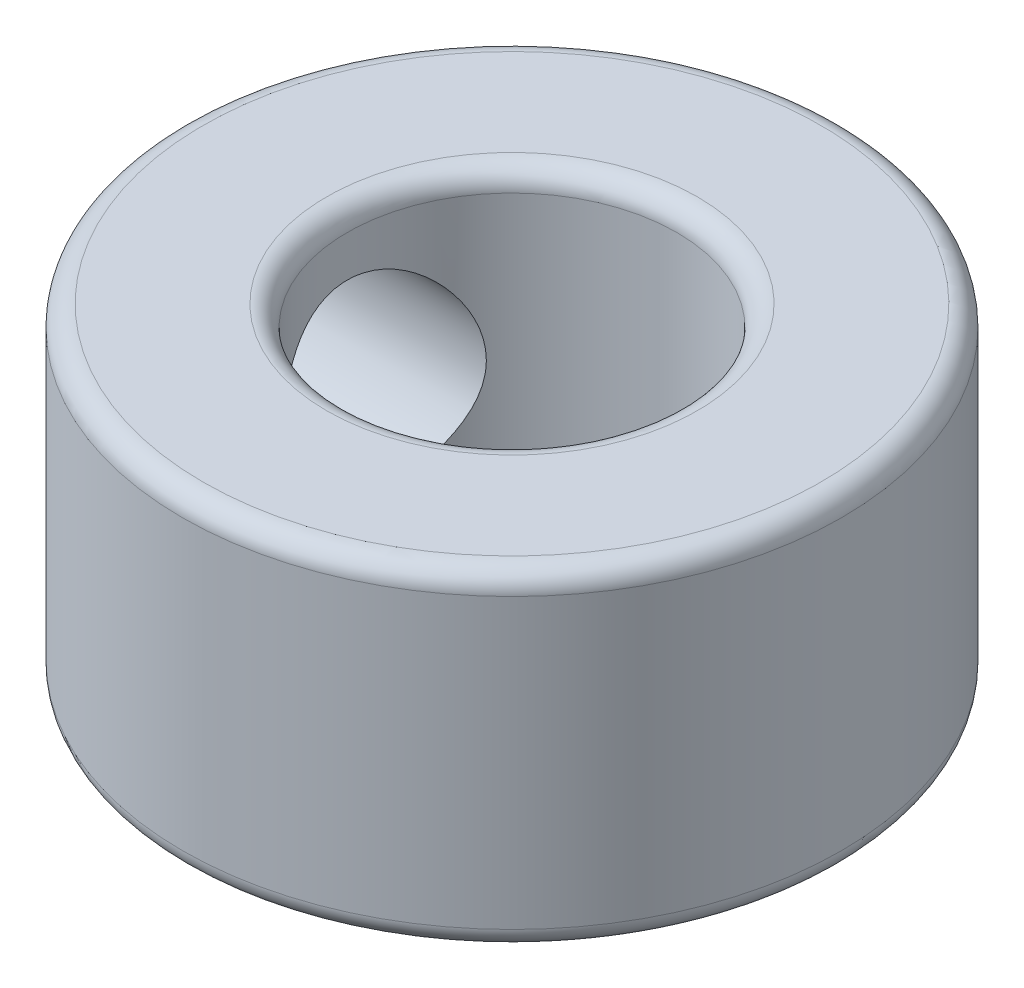
ISO-10303-21;
HEADER;
FILE_DESCRIPTION(('STEP AP214'),'2;1');
FILE_NAME('part.step','',(''),(''),'','','');
FILE_SCHEMA(('AUTOMOTIVE_DESIGN { 1 0 10303 214 1 1 1 1 }'));
ENDSEC;
DATA;
#1=APPLICATION_CONTEXT('core data for automotive mechanical design processes');
#2=APPLICATION_PROTOCOL_DEFINITION('international standard','automotive_design',2000,#1);
#3=PRODUCT_CONTEXT('',#1,'mechanical');
#4=PRODUCT('Part','Part','',(#3));
#5=PRODUCT_RELATED_PRODUCT_CATEGORY('part','',(#4));
#6=PRODUCT_DEFINITION_FORMATION('','',#4);
#7=PRODUCT_DEFINITION_CONTEXT('part definition',#1,'design');
#8=PRODUCT_DEFINITION('design','',#6,#7);
#9=PRODUCT_DEFINITION_SHAPE('','',#8);
#10=(LENGTH_UNIT() NAMED_UNIT(*) SI_UNIT(.MILLI.,.METRE.));
#11=(NAMED_UNIT(*) PLANE_ANGLE_UNIT() SI_UNIT($,.RADIAN.));
#12=(NAMED_UNIT(*) SI_UNIT($,.STERADIAN.) SOLID_ANGLE_UNIT());
#13=UNCERTAINTY_MEASURE_WITH_UNIT(LENGTH_MEASURE(1.E-05),#10,'distance_accuracy_value','');
#14=(GEOMETRIC_REPRESENTATION_CONTEXT(3) GLOBAL_UNCERTAINTY_ASSIGNED_CONTEXT((#13)) GLOBAL_UNIT_ASSIGNED_CONTEXT((#10,
#11,#12)) REPRESENTATION_CONTEXT('',''));
#15=CARTESIAN_POINT('',(0.,0.,0.));
#16=DIRECTION('',(0.,0.,1.));
#17=DIRECTION('',(1.,0.,0.));
#18=AXIS2_PLACEMENT_3D('',#15,#16,#17);
#19=CARTESIAN_POINT('',(0.,8.,0.));
#20=DIRECTION('',(0.,1.,0.));
#21=DIRECTION('',(0.,0.,1.));
#22=AXIS2_PLACEMENT_3D('',#19,#20,#21);
#23=PLANE('',#22);
#24=CARTESIAN_POINT('',(0.,8.,0.));
#25=DIRECTION('',(0.,1.,0.));
#26=DIRECTION('',(0.,0.,1.));
#27=AXIS2_PLACEMENT_3D('',#24,#25,#26);
#28=CIRCLE('',#27,4.5);
#29=CARTESIAN_POINT('',(0.,8.,4.5));
#30=VERTEX_POINT('',#29);
#31=EDGE_CURVE('E43',#30,#30,#28,.F.);
#32=ORIENTED_EDGE('',*,*,#31,.T.);
#33=EDGE_LOOP('',(#32));
#34=FACE_BOUND('',#33,.T.);
#35=CARTESIAN_POINT('',(0.,8.,0.));
#36=DIRECTION('',(0.,1.,0.));
#37=DIRECTION('',(0.,0.,1.));
#38=AXIS2_PLACEMENT_3D('',#35,#36,#37);
#39=CIRCLE('',#38,7.5);
#40=CARTESIAN_POINT('',(0.,8.,7.5));
#41=VERTEX_POINT('',#40);
#42=EDGE_CURVE('E47',#41,#41,#39,.T.);
#43=ORIENTED_EDGE('',*,*,#42,.T.);
#44=EDGE_LOOP('',(#43));
#45=FACE_BOUND('',#44,.T.);
#46=ADVANCED_FACE('F32',(#34,#45),#23,.T.);
#47=CARTESIAN_POINT('',(0.,0.,0.));
#48=DIRECTION('',(0.,1.,0.));
#49=DIRECTION('',(0.,0.,1.));
#50=AXIS2_PLACEMENT_3D('',#47,#48,#49);
#51=PLANE('',#50);
#52=CARTESIAN_POINT('',(0.,0.,0.));
#53=DIRECTION('',(0.,1.,0.));
#54=DIRECTION('',(0.,0.,1.));
#55=AXIS2_PLACEMENT_3D('',#52,#53,#54);
#56=CIRCLE('',#55,4.5);
#57=CARTESIAN_POINT('',(0.,0.,4.5));
#58=VERTEX_POINT('',#57);
#59=EDGE_CURVE('E58',#58,#58,#56,.T.);
#60=ORIENTED_EDGE('',*,*,#59,.T.);
#61=EDGE_LOOP('',(#60));
#62=FACE_BOUND('',#61,.T.);
#63=CARTESIAN_POINT('',(0.,0.,0.));
#64=DIRECTION('',(0.,1.,0.));
#65=DIRECTION('',(0.,0.,1.));
#66=AXIS2_PLACEMENT_3D('',#63,#64,#65);
#67=CIRCLE('',#66,7.5);
#68=CARTESIAN_POINT('',(0.,0.,7.5));
#69=VERTEX_POINT('',#68);
#70=EDGE_CURVE('E61',#69,#69,#67,.F.);
#71=ORIENTED_EDGE('',*,*,#70,.T.);
#72=EDGE_LOOP('',(#71));
#73=FACE_BOUND('',#72,.T.);
#74=ADVANCED_FACE('F97',(#62,#73),#51,.F.);
#75=CARTESIAN_POINT('',(0.,8.,0.));
#76=DIRECTION('',(0.,-1.,0.));
#77=DIRECTION('',(0.,0.,-1.));
#78=AXIS2_PLACEMENT_3D('',#75,#76,#77);
#79=CYLINDRICAL_SURFACE('',#78,8.);
#80=CARTESIAN_POINT('',(0.,0.5,0.));
#81=DIRECTION('',(0.,1.,0.));
#82=DIRECTION('',(0.,0.,1.));
#83=AXIS2_PLACEMENT_3D('',#80,#81,#82);
#84=CIRCLE('',#83,8.);
#85=CARTESIAN_POINT('',(0.,0.5,8.));
#86=VERTEX_POINT('',#85);
#87=EDGE_CURVE('E10',#86,#86,#84,.T.);
#88=ORIENTED_EDGE('',*,*,#87,.T.);
#89=EDGE_LOOP('',(#88));
#90=FACE_BOUND('',#89,.T.);
#91=CARTESIAN_POINT('',(0.,7.5,0.));
#92=DIRECTION('',(0.,1.,0.));
#93=DIRECTION('',(0.,0.,1.));
#94=AXIS2_PLACEMENT_3D('',#91,#92,#93);
#95=CIRCLE('',#94,8.);
#96=CARTESIAN_POINT('',(0.,7.5,8.));
#97=VERTEX_POINT('',#96);
#98=EDGE_CURVE('E39',#97,#97,#95,.F.);
#99=ORIENTED_EDGE('',*,*,#98,.T.);
#100=EDGE_LOOP('',(#99));
#101=FACE_BOUND('',#100,.T.);
#102=CARTESIAN_POINT('',(-8.,1.5,0.));
#103=CARTESIAN_POINT('',(-7.9999993175598,1.50000089317515,-0.136878370349093));
#104=CARTESIAN_POINT('',(-7.99645389969682,1.51127845388891,-0.273766105005719));
#105=CARTESIAN_POINT('',(-7.98265788177613,1.55597248307847,-0.543538419176897));
#106=CARTESIAN_POINT('',(-7.97240576399719,1.58939396272872,-0.676422085451815));
#107=CARTESIAN_POINT('',(-7.94631631395819,1.67713874239147,-0.934257087301613));
#108=CARTESIAN_POINT('',(-7.9304876299805,1.73142968930593,-1.05922035397161));
#109=CARTESIAN_POINT('',(-7.89487938322185,1.85923463535666,-1.29826960469292));
#110=CARTESIAN_POINT('',(-7.8750991979981,1.93275166356117,-1.41235387088977));
#111=CARTESIAN_POINT('',(-7.83300427480565,2.09931198403472,-1.62993066990456));
#112=CARTESIAN_POINT('',(-7.81063431853978,2.19284177012214,-1.73304005631332));
#113=CARTESIAN_POINT('',(-7.76620092748417,2.3957367848271,-1.92239476407399));
#114=CARTESIAN_POINT('',(-7.74413755046914,2.50510495498909,-2.00863694579739));
#115=CARTESIAN_POINT('',(-7.70222289396344,2.73988912761617,-2.16388672966227));
#116=CARTESIAN_POINT('',(-7.68243976603591,2.86563495505444,-2.23241568300258));
#117=CARTESIAN_POINT('',(-7.64815603598469,3.12758462996375,-2.34719482153343));
#118=CARTESIAN_POINT('',(-7.63365404257377,3.26378571158786,-2.39345087543889));
#119=CARTESIAN_POINT('',(-7.61215213969001,3.53845615490412,-2.46096919860067));
#120=CARTESIAN_POINT('',(-7.60493945859017,3.67673368727771,-2.48294220015729));
#121=CARTESIAN_POINT('',(-7.59820110281901,3.95518623782379,-2.50349110073976));
#122=CARTESIAN_POINT('',(-7.59867338454668,4.09536074164332,-2.50207321991544));
#123=CARTESIAN_POINT('',(-7.60706378150876,4.36774892053797,-2.47643649465479));
#124=CARTESIAN_POINT('',(-7.61468683491897,4.50005825172313,-2.45312115738766));
#125=CARTESIAN_POINT('',(-7.63604051304978,4.75878431307469,-2.38581626711252));
#126=CARTESIAN_POINT('',(-7.64977178686229,4.8852004154176,-2.34182451689101));
#127=CARTESIAN_POINT('',(-7.68202088028593,5.13070388886527,-2.23377749362554));
#128=CARTESIAN_POINT('',(-7.70060569321649,5.24965722138397,-2.16943851324164));
#129=CARTESIAN_POINT('',(-7.7404371316014,5.47537553575825,-2.02272041475696));
#130=CARTESIAN_POINT('',(-7.76168444789102,5.58213734050743,-1.94033661043155));
#131=CARTESIAN_POINT('',(-7.80563055600986,5.78554988683398,-1.75543390836425));
#132=CARTESIAN_POINT('',(-7.82835139211391,5.88151911555937,-1.65216914118564));
#133=CARTESIAN_POINT('',(-7.8718314151916,6.05494378715936,-1.43072881619106));
#134=CARTESIAN_POINT('',(-7.89259045676745,6.13239785843842,-1.31255215469804));
#135=CARTESIAN_POINT('',(-7.93002589780382,6.26705537720255,-1.06332922093091));
#136=CARTESIAN_POINT('',(-7.94666921296415,6.32409627092794,-0.932189813838558));
#137=CARTESIAN_POINT('',(-7.97375911657108,6.41510600170313,-0.661535955565288));
#138=CARTESIAN_POINT('',(-7.98420758650304,6.44908184447679,-0.522024061449216));
#139=CARTESIAN_POINT('',(-7.99742778790027,6.49183608515796,-0.24437031458069));
#140=CARTESIAN_POINT('',(-8.00048045790873,6.50153708718705,-0.106383697577686));
#141=CARTESIAN_POINT('',(-7.99939599461967,6.49806754672534,0.169260611465172));
#142=CARTESIAN_POINT('',(-7.9952599116227,6.48490034535478,0.306918348613018));
#143=CARTESIAN_POINT('',(-7.98044727539523,6.43680881478723,0.574438665951698));
#144=CARTESIAN_POINT('',(-7.96993586221374,6.40243346477503,0.704409956841873));
#145=CARTESIAN_POINT('',(-7.94360242758579,6.31357129526657,0.956703857722754));
#146=CARTESIAN_POINT('',(-7.92777975028687,6.25908199194998,1.07902552089812));
#147=CARTESIAN_POINT('',(-7.89197085518848,6.13005356690263,1.31586481334438));
#148=CARTESIAN_POINT('',(-7.87189253635335,6.05505802500638,1.43011947957558));
#149=CARTESIAN_POINT('',(-7.82986820006859,5.88769357976515,1.64473170192052));
#150=CARTESIAN_POINT('',(-7.80792167695774,5.79531996451072,1.7450854760879));
#151=CARTESIAN_POINT('',(-7.76353989766283,5.5914822198958,1.93317492583804));
#152=CARTESIAN_POINT('',(-7.74111973412883,5.47940667252155,2.02025304679063));
#153=CARTESIAN_POINT('',(-7.69923894191212,5.24174676724645,2.17442500490303));
#154=CARTESIAN_POINT('',(-7.67977826622621,5.11616262394603,2.24151915946859));
#155=CARTESIAN_POINT('',(-7.64623564661738,4.85530965425905,2.35340166961085));
#156=CARTESIAN_POINT('',(-7.63213292713749,4.72008070112856,2.39827639112025));
#157=CARTESIAN_POINT('',(-7.6110234168862,4.44345501350276,2.4644578863618));
#158=CARTESIAN_POINT('',(-7.60401392602456,4.30206064731293,2.48577362827989));
#159=CARTESIAN_POINT('',(-7.59816585427753,4.02399182483914,2.50358812316251));
#160=CARTESIAN_POINT('',(-7.59897209200284,3.88739309230516,2.50116559243271));
#161=CARTESIAN_POINT('',(-7.60780180751807,3.61665083011612,2.47417636257668));
#162=CARTESIAN_POINT('',(-7.61582494863208,3.48250718622653,2.44961069645024));
#163=CARTESIAN_POINT('',(-7.6379362836678,3.22241192081621,2.37975459827235));
#164=CARTESIAN_POINT('',(-7.65193396380513,3.09636911781328,2.33477284812016));
#165=CARTESIAN_POINT('',(-7.68439408509128,2.85351917293199,2.22560454669999));
#166=CARTESIAN_POINT('',(-7.70285743429343,2.73671391584319,2.16141408888474));
#167=CARTESIAN_POINT('',(-7.74306974067005,2.51070805912037,2.01271350026986));
#168=CARTESIAN_POINT('',(-7.76491897845913,2.40198374099952,1.92750667048265));
#169=CARTESIAN_POINT('',(-7.8089799764242,2.200027343776,1.7404179928096));
#170=CARTESIAN_POINT('',(-7.83119183213309,2.10679942201788,1.63853168468878));
#171=CARTESIAN_POINT('',(-7.87434543904947,1.93543492327414,1.41697332564669));
#172=CARTESIAN_POINT('',(-7.89522203461346,1.8578905271001,1.29682914897477));
#173=CARTESIAN_POINT('',(-7.93253538593756,1.72420216972109,1.0445582760273));
#174=CARTESIAN_POINT('',(-7.94897388631644,1.66804979571633,0.912436315590896));
#175=CARTESIAN_POINT('',(-7.97441301466941,1.58281726478307,0.651495270747956));
#176=CARTESIAN_POINT('',(-7.98392481612283,1.55185026538932,0.523340674225091));
#177=CARTESIAN_POINT('',(-7.99671800680967,1.51044328006457,0.263459790880494));
#178=CARTESIAN_POINT('',(-8.00000065679286,1.49999914039199,0.131734232279349));
#179=CARTESIAN_POINT('',(-8.,1.5,0.));
#180=B_SPLINE_CURVE_WITH_KNOTS('',3,(#102,#103,#104,#105,#106,#107,#108,#109,#110,#111,#112,
#113,#114,#115,#116,#117,#118,#119,#120,#121,#122,#123,#124,#125,#126,#127,#128,#129,#130,#131,
#132,#133,#134,#135,#136,#137,#138,#139,#140,#141,#142,#143,#144,#145,#146,#147,#148,#149,#150,
#151,#152,#153,#154,#155,#156,#157,#158,#159,#160,#161,#162,#163,#164,#165,#166,#167,#168,#169,
#170,#171,#172,#173,#174,#175,#176,#177,#178,#179),.UNSPECIFIED.,.T.,.F.,(4,2,2,2,2,2,2,2,2,2,2,
2,2,2,2,2,2,2,2,2,2,2,2,2,2,2,2,2,2,2,2,2,2,2,2,2,2,2,4),(0.,0.41015089886502,0.820394646698133,
1.23000495840487,1.63967984311678,2.06075644390317,2.48191134862552,2.91347542494988,
3.34492572559054,3.7633830033442,4.18172900590277,4.58353834844338,4.98539039958126,
5.39311285441091,5.80094132020717,6.227334945592,6.65376014826607,7.0835092137954,
7.51312768989108,7.92615137096475,8.33911471298726,8.74181253445744,9.14456010069,
9.55712649476686,9.96980491418519,10.3988355742628,10.8278594196742,11.2552023150671,
11.6823824779468,12.0902440696666,12.4980866352126,12.8999582681244,13.3019116867944,
13.7195902803182,14.1373807476578,14.5688133627192,15.0000761335177,15.3948927332218,
15.7896294154519),.UNSPECIFIED.);
#181=CARTESIAN_POINT('',(-8.,1.5,0.));
#182=VERTEX_POINT('',#181);
#183=EDGE_CURVE('E64',#182,#182,#180,.T.);
#184=ORIENTED_EDGE('',*,*,#183,.T.);
#185=EDGE_LOOP('',(#184));
#186=FACE_BOUND('',#185,.T.);
#187=ADVANCED_FACE('F93',(#90,#101,#186),#79,.T.);
#188=CARTESIAN_POINT('',(0.,8.,0.));
#189=DIRECTION('',(0.,-1.,0.));
#190=DIRECTION('',(0.,0.,-1.));
#191=AXIS2_PLACEMENT_3D('',#188,#189,#190);
#192=CYLINDRICAL_SURFACE('',#191,4.);
#193=CARTESIAN_POINT('',(0.,0.5,0.));
#194=DIRECTION('',(0.,1.,0.));
#195=DIRECTION('',(0.,0.,1.));
#196=AXIS2_PLACEMENT_3D('',#193,#194,#195);
#197=CIRCLE('',#196,4.);
#198=CARTESIAN_POINT('',(0.,0.5,4.));
#199=VERTEX_POINT('',#198);
#200=EDGE_CURVE('E52',#199,#199,#197,.F.);
#201=ORIENTED_EDGE('',*,*,#200,.T.);
#202=EDGE_LOOP('',(#201));
#203=FACE_BOUND('',#202,.T.);
#204=CARTESIAN_POINT('',(0.,7.5,0.));
#205=DIRECTION('',(0.,1.,0.));
#206=DIRECTION('',(0.,0.,1.));
#207=AXIS2_PLACEMENT_3D('',#204,#205,#206);
#208=CIRCLE('',#207,4.);
#209=CARTESIAN_POINT('',(0.,7.5,4.));
#210=VERTEX_POINT('',#209);
#211=EDGE_CURVE('E55',#210,#210,#208,.T.);
#212=ORIENTED_EDGE('',*,*,#211,.T.);
#213=EDGE_LOOP('',(#212));
#214=FACE_BOUND('',#213,.T.);
#215=CARTESIAN_POINT('',(-3.1224989991992,4.,-2.5));
#216=CARTESIAN_POINT('',(-3.12249991555421,4.06215675144551,-2.49999941097139));
#217=CARTESIAN_POINT('',(-3.12436490733917,4.12432594667079,-2.49767581942173));
#218=CARTESIAN_POINT('',(-3.13172923119026,4.24811717954774,-2.48843349840857));
#219=CARTESIAN_POINT('',(-3.13723070381364,4.3097388732571,-2.48151206248433));
#220=CARTESIAN_POINT('',(-3.15888953558505,4.49322604774371,-2.45397595058365));
#221=CARTESIAN_POINT('',(-3.18020036271142,4.61354833118898,-2.42658990946459));
#222=CARTESIAN_POINT('',(-3.23299770760367,4.84559819787824,-2.35576217141198));
#223=CARTESIAN_POINT('',(-3.26439575383209,4.9573904150551,-2.31245961359202));
#224=CARTESIAN_POINT('',(-3.3336600088444,5.17200852533406,-2.21143916430899));
#225=CARTESIAN_POINT('',(-3.37152639405534,5.27483417375309,-2.15372087963017));
#226=CARTESIAN_POINT('',(-3.45559225121876,5.48373398130366,-2.01647682425578));
#227=CARTESIAN_POINT('',(-3.50222814511578,5.58839332500452,-1.93506425666949));
#228=CARTESIAN_POINT('',(-3.59505503533368,5.7837615516238,-1.75662526657432));
#229=CARTESIAN_POINT('',(-3.64124561158438,5.87445827995362,-1.65958538899782));
#230=CARTESIAN_POINT('',(-3.73459524771314,6.05022029817268,-1.43833990582854));
#231=CARTESIAN_POINT('',(-3.78119887781505,6.13328618445043,-1.31226934259652));
#232=CARTESIAN_POINT('',(-3.84307251838774,6.24054515473624,-1.11163395543429));
#233=CARTESIAN_POINT('',(-3.86236283092052,6.27341513833311,-1.04281240974104));
#234=CARTESIAN_POINT('',(-3.89770436975436,6.33295468536328,-0.901758767615549));
#235=CARTESIAN_POINT('',(-3.91375783207118,6.35962853103842,-0.829529068393797));
#236=CARTESIAN_POINT('',(-3.94066759113823,6.40398381525628,-0.689700297916576));
#237=CARTESIAN_POINT('',(-3.95188535984466,6.42230197651811,-0.622371981278588));
#238=CARTESIAN_POINT('',(-3.97096241909162,6.45330228631336,-0.485997575898808));
#239=CARTESIAN_POINT('',(-3.97882364879721,6.46598768921621,-0.416952503441683));
#240=CARTESIAN_POINT('',(-3.99095470334737,6.48551379763454,-0.277765449857174));
#241=CARTESIAN_POINT('',(-3.99522674847834,6.49235811651341,-0.207624174243906));
#242=CARTESIAN_POINT('',(-4.00006125072438,6.50009921338922,-0.0669114466599393));
#243=CARTESIAN_POINT('',(-4.00062413482248,6.50099667596335,0.00365995486027859));
#244=CARTESIAN_POINT('',(-3.99704479619503,6.49527462645275,0.196045081555538));
#245=CARTESIAN_POINT('',(-3.98917040897436,6.48269349692112,0.317681845488536));
#246=CARTESIAN_POINT('',(-3.96290903275931,6.44026978203388,0.556636494620255));
#247=CARTESIAN_POINT('',(-3.94452124920477,6.41042589202638,0.673954052677426));
#248=CARTESIAN_POINT('',(-3.89876170711609,6.33479144071674,0.901771991763867));
#249=CARTESIAN_POINT('',(-3.87136697381047,6.28896008042893,1.01225407159606));
#250=CARTESIAN_POINT('',(-3.80971291751354,6.18306276101571,1.22404012071223));
#251=CARTESIAN_POINT('',(-3.77545203089318,6.12299355893635,1.32534199174245));
#252=CARTESIAN_POINT('',(-3.69786441247167,5.98194358307633,1.52942649744659));
#253=CARTESIAN_POINT('',(-3.65394006381521,5.89929072330952,1.63082454612907));
#254=CARTESIAN_POINT('',(-3.56390927740507,5.71973526279293,1.81919733573063));
#255=CARTESIAN_POINT('',(-3.51779973570409,5.62281195361603,1.90615071842624));
#256=CARTESIAN_POINT('',(-3.42142883464466,5.40258874682652,2.07470887167909));
#257=CARTESIAN_POINT('',(-3.37141162686597,5.27749723664192,2.15413229677844));
#258=CARTESIAN_POINT('',(-3.28028278192382,5.01270776269859,2.29052307550563));
#259=CARTESIAN_POINT('',(-3.23915480386931,4.8730373125469,2.34753179448504));
#260=CARTESIAN_POINT('',(-3.18183753131763,4.62046119389376,2.42437133527931));
#261=CARTESIAN_POINT('',(-3.16193408602513,4.51017807478651,2.45003683445404));
#262=CARTESIAN_POINT('',(-3.13358277759547,4.28576962244011,2.48620337073091));
#263=CARTESIAN_POINT('',(-3.12511926504439,4.1716497573432,2.49672512520811));
#264=CARTESIAN_POINT('',(-3.12092267030677,3.94254263949755,2.5019707209518));
#265=CARTESIAN_POINT('',(-3.12521876170185,3.82755399952155,2.49665835896695));
#266=CARTESIAN_POINT('',(-3.14592085836188,3.60043883568152,2.47051466367814));
#267=CARTESIAN_POINT('',(-3.16233689222906,3.48831476162882,2.44967047849126));
#268=CARTESIAN_POINT('',(-3.20460120797143,3.27156324057431,2.39409874195038));
#269=CARTESIAN_POINT('',(-3.23028954367817,3.16684268410568,2.35960571424758));
#270=CARTESIAN_POINT('',(-3.28831148388749,2.96442530010621,2.27804893702243));
#271=CARTESIAN_POINT('',(-3.32064744602081,2.86673098112204,2.23098072583747));
#272=CARTESIAN_POINT('',(-3.39574401285203,2.66138805833681,2.11530798730694));
#273=CARTESIAN_POINT('',(-3.43931724293015,2.55538547269823,2.04430931160544));
#274=CARTESIAN_POINT('',(-3.52787943213338,2.35562933934574,1.88737868921489));
#275=CARTESIAN_POINT('',(-3.57286982004467,2.26188867875766,1.80143124902619));
#276=CARTESIAN_POINT('',(-3.66766209459505,2.07403592935904,1.60076932492121));
#277=CARTESIAN_POINT('',(-3.71707933883201,1.9822726015151,1.48365201617177));
#278=CARTESIAN_POINT('',(-3.80768973398606,1.81985298528028,1.23256787407809));
#279=CARTESIAN_POINT('',(-3.84888673619009,1.74918680487308,1.09860897940974));
#280=CARTESIAN_POINT('',(-3.89988966499776,1.66341893202502,0.891930804655081));
#281=CARTESIAN_POINT('',(-3.91477055097245,1.63870255604872,0.82431819603942));
#282=CARTESIAN_POINT('',(-3.94124643918619,1.59506172326772,0.686640792876423));
#283=CARTESIAN_POINT('',(-3.95284334314805,1.57613391384908,0.616577444051136));
#284=CARTESIAN_POINT('',(-3.9723851203995,1.54439416986075,0.474639231464263));
#285=CARTESIAN_POINT('',(-3.98033317908836,1.53157690048357,0.402766005755507));
#286=CARTESIAN_POINT('',(-3.99234168343343,1.51226082770711,0.25788180714246));
#287=CARTESIAN_POINT('',(-3.99640277220024,1.50576097906921,0.184871024482534));
#288=CARTESIAN_POINT('',(-4.00191521492706,1.49692848449289,-0.0131102774248939));
#289=CARTESIAN_POINT('',(-3.99952706123947,1.50073420709059,-0.138539079205451));
#290=CARTESIAN_POINT('',(-3.98321975018363,1.52691758954553,-0.386583137102133));
#291=CARTESIAN_POINT('',(-3.96930111604857,1.54929440667881,-0.509198520626832));
#292=CARTESIAN_POINT('',(-3.93192083384285,1.61032241554611,-0.74408060548385));
#293=CARTESIAN_POINT('',(-3.90880701054803,1.64838207356467,-0.856558752631812));
#294=CARTESIAN_POINT('',(-3.85489971248843,1.73911946244348,-1.07343034721918));
#295=CARTESIAN_POINT('',(-3.82410494215309,1.7917996595672,-1.17782242685803));
#296=CARTESIAN_POINT('',(-3.75350673935648,1.91632127871995,-1.38731297754797));
#297=CARTESIAN_POINT('',(-3.71310001864657,1.9895839907575,-1.4913601218378));
#298=CARTESIAN_POINT('',(-3.62867283985206,2.1501532325141,-1.68643334934802));
#299=CARTESIAN_POINT('',(-3.58464833191203,2.23747560883428,-1.77744451843681));
#300=CARTESIAN_POINT('',(-3.49000828219719,2.43823251506187,-1.95744716561589));
#301=CARTESIAN_POINT('',(-3.43935738427104,2.55361661257142,-2.04425661250063));
#302=CARTESIAN_POINT('',(-3.34349647457112,2.79928940975976,-2.19754648509904));
#303=CARTESIAN_POINT('',(-3.2982834620419,2.92956981115252,-2.26403815415028));
#304=CARTESIAN_POINT('',(-3.22859539780091,3.17280530078491,-2.3619822941284));
#305=CARTESIAN_POINT('',(-3.20174639338769,3.28327057215356,-2.39792458576829));
#306=CARTESIAN_POINT('',(-3.1587835810451,3.50993934300177,-2.45425618419746));
#307=CARTESIAN_POINT('',(-3.14263581150428,3.62612341979972,-2.47469472410168));
#308=CARTESIAN_POINT('',(-3.12952857640607,3.78605999464607,-2.49119847139522));
#309=CARTESIAN_POINT('',(-3.1268999430677,3.82872552570866,-2.4944943383796));
#310=CARTESIAN_POINT('',(-3.12338461939862,3.91425869895175,-2.49889558125807));
#311=CARTESIAN_POINT('',(-3.12249836712871,3.95712638924335,-2.50000040629188));
#312=CARTESIAN_POINT('',(-3.1224989991992,4.,-2.5));
#313=B_SPLINE_CURVE_WITH_KNOTS('',3,(#215,#216,#217,#218,#219,#220,#221,#222,#223,#224,#225,
#226,#227,#228,#229,#230,#231,#232,#233,#234,#235,#236,#237,#238,#239,#240,#241,#242,#243,#244,
#245,#246,#247,#248,#249,#250,#251,#252,#253,#254,#255,#256,#257,#258,#259,#260,#261,#262,#263,
#264,#265,#266,#267,#268,#269,#270,#271,#272,#273,#274,#275,#276,#277,#278,#279,#280,#281,#282,
#283,#284,#285,#286,#287,#288,#289,#290,#291,#292,#293,#294,#295,#296,#297,#298,#299,#300,#301,
#302,#303,#304,#305,#306,#307,#308,#309,#310,#311,#312),.UNSPECIFIED.,.T.,.F.,(4,2,2,2,2,2,2,2,
2,2,2,2,2,2,2,2,2,2,2,2,2,2,2,2,2,2,2,2,2,2,2,2,2,2,2,2,2,2,2,2,2,2,2,2,2,2,2,2,4),(0.,
0.186415315858461,0.372940459994496,0.746478880764687,1.11682668423133,1.48718459072605,
1.90722798685071,2.32763499192879,2.7987602926597,3.03445880867314,3.26999394209509,
3.48170145743206,3.69328649746504,3.90474055342595,4.11617026725867,4.48184709708114,
4.84755156693919,5.21419620193004,5.58092442797435,5.99329080205307,6.40626158573465,
6.87316206383505,7.33919680735486,7.68265621505466,8.02564530559509,8.36941921026407,
8.7134778886509,9.05186495232126,9.390372235192,9.79332737765188,10.1967026751544,
10.6647326786671,11.1325428866818,11.3527929661039,11.5729152387446,11.7928449800804,
12.0127383271002,12.3871595324234,12.7615637480926,13.1229788842094,13.4844550226785,
13.8834503840958,14.2828986410983,14.7399238503459,15.1966956936287,15.5530255473292,
15.9082190611886,16.0367696833384,16.1653526209168),.UNSPECIFIED.);
#314=CARTESIAN_POINT('',(-3.1224989991992,4.,-2.5));
#315=VERTEX_POINT('',#314);
#316=EDGE_CURVE('E65',#315,#315,#313,.T.);
#317=ORIENTED_EDGE('',*,*,#316,.F.);
#318=EDGE_LOOP('',(#317));
#319=FACE_BOUND('',#318,.T.);
#320=ADVANCED_FACE('F77',(#203,#214,#319),#192,.F.);
#321=CARTESIAN_POINT('',(-8.,4.,0.));
#322=DIRECTION('',(1.,0.,0.));
#323=DIRECTION('',(0.,0.,-1.));
#324=AXIS2_PLACEMENT_3D('',#321,#322,#323);
#325=CYLINDRICAL_SURFACE('',#324,2.5);
#326=ORIENTED_EDGE('',*,*,#316,.T.);
#327=EDGE_LOOP('',(#326));
#328=FACE_BOUND('',#327,.T.);
#329=ORIENTED_EDGE('',*,*,#183,.F.);
#330=EDGE_LOOP('',(#329));
#331=FACE_BOUND('',#330,.T.);
#332=ADVANCED_FACE('F80',(#328,#331),#325,.F.);
#333=CARTESIAN_POINT('',(0.,0.5,0.));
#334=DIRECTION('',(0.,1.,0.));
#335=DIRECTION('',(0.,0.,1.));
#336=AXIS2_PLACEMENT_3D('',#333,#334,#335);
#337=TOROIDAL_SURFACE('',#336,4.5,0.5);
#338=ORIENTED_EDGE('',*,*,#200,.F.);
#339=EDGE_LOOP('',(#338));
#340=FACE_BOUND('',#339,.T.);
#341=ORIENTED_EDGE('',*,*,#59,.F.);
#342=EDGE_LOOP('',(#341));
#343=FACE_BOUND('',#342,.T.);
#344=ADVANCED_FACE('F83',(#340,#343),#337,.T.);
#345=CARTESIAN_POINT('',(0.,7.5,0.));
#346=DIRECTION('',(0.,1.,0.));
#347=DIRECTION('',(0.,0.,1.));
#348=AXIS2_PLACEMENT_3D('',#345,#346,#347);
#349=TOROIDAL_SURFACE('',#348,4.5,0.5);
#350=ORIENTED_EDGE('',*,*,#31,.F.);
#351=EDGE_LOOP('',(#350));
#352=FACE_BOUND('',#351,.T.);
#353=ORIENTED_EDGE('',*,*,#211,.F.);
#354=EDGE_LOOP('',(#353));
#355=FACE_BOUND('',#354,.T.);
#356=ADVANCED_FACE('F90',(#352,#355),#349,.T.);
#357=CARTESIAN_POINT('',(0.,0.5,0.));
#358=DIRECTION('',(0.,1.,0.));
#359=DIRECTION('',(0.,0.,1.));
#360=AXIS2_PLACEMENT_3D('',#357,#358,#359);
#361=TOROIDAL_SURFACE('',#360,7.5,0.5);
#362=ORIENTED_EDGE('',*,*,#70,.F.);
#363=EDGE_LOOP('',(#362));
#364=FACE_BOUND('',#363,.T.);
#365=ORIENTED_EDGE('',*,*,#87,.F.);
#366=EDGE_LOOP('',(#365));
#367=FACE_BOUND('',#366,.T.);
#368=ADVANCED_FACE('F109',(#364,#367),#361,.T.);
#369=CARTESIAN_POINT('',(0.,7.5,0.));
#370=DIRECTION('',(0.,1.,0.));
#371=DIRECTION('',(0.,0.,1.));
#372=AXIS2_PLACEMENT_3D('',#369,#370,#371);
#373=TOROIDAL_SURFACE('',#372,7.5,0.5);
#374=ORIENTED_EDGE('',*,*,#98,.F.);
#375=EDGE_LOOP('',(#374));
#376=FACE_BOUND('',#375,.T.);
#377=ORIENTED_EDGE('',*,*,#42,.F.);
#378=EDGE_LOOP('',(#377));
#379=FACE_BOUND('',#378,.T.);
#380=ADVANCED_FACE('F34',(#376,#379),#373,.T.);
#381=CLOSED_SHELL('',(#46,#74,#187,#320,#332,#344,#356,#368,#380));
#382=MANIFOLD_SOLID_BREP('B2',#381);
#383=ADVANCED_BREP_SHAPE_REPRESENTATION('',(#18,#382),#14);
#384=SHAPE_DEFINITION_REPRESENTATION(#9,#383);
ENDSEC;
END-ISO-10303-21;
